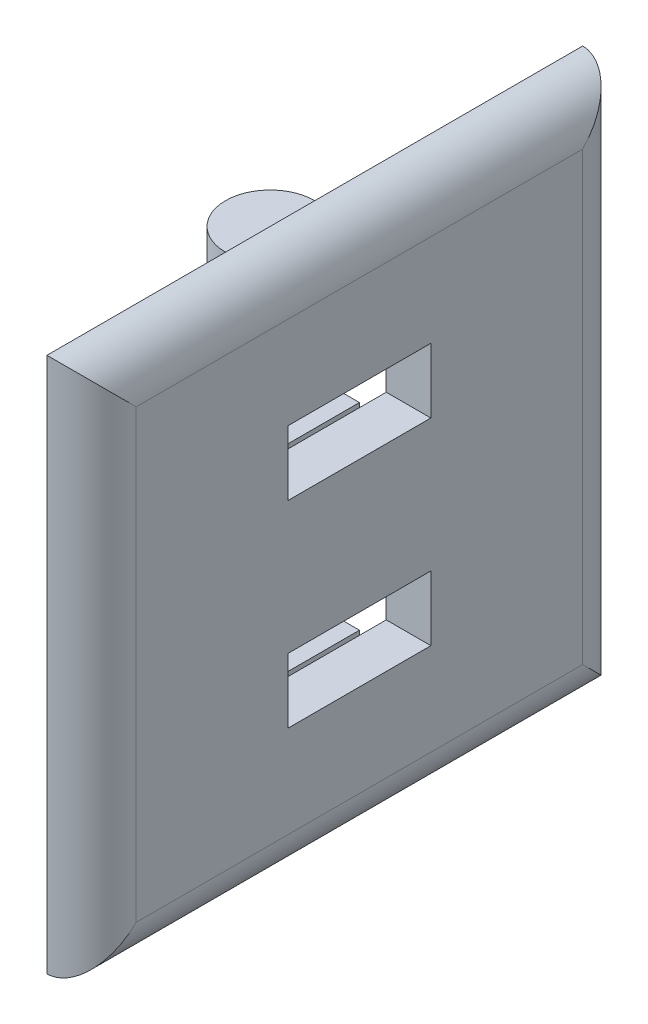
ISO-10303-21;
HEADER;
FILE_DESCRIPTION(('STEP AP214'),'2;1');
FILE_NAME('part.step','',(''),(''),'','','');
FILE_SCHEMA(('AUTOMOTIVE_DESIGN { 1 0 10303 214 1 1 1 1 }'));
ENDSEC;
DATA;
#1=APPLICATION_CONTEXT('core data for automotive mechanical design processes');
#2=APPLICATION_PROTOCOL_DEFINITION('international standard','automotive_design',2000,#1);
#3=PRODUCT_CONTEXT('',#1,'mechanical');
#4=PRODUCT('Part','Part','',(#3));
#5=PRODUCT_RELATED_PRODUCT_CATEGORY('part','',(#4));
#6=PRODUCT_DEFINITION_FORMATION('','',#4);
#7=PRODUCT_DEFINITION_CONTEXT('part definition',#1,'design');
#8=PRODUCT_DEFINITION('design','',#6,#7);
#9=PRODUCT_DEFINITION_SHAPE('','',#8);
#10=(LENGTH_UNIT() NAMED_UNIT(*) SI_UNIT(.MILLI.,.METRE.));
#11=(NAMED_UNIT(*) PLANE_ANGLE_UNIT() SI_UNIT($,.RADIAN.));
#12=(NAMED_UNIT(*) SI_UNIT($,.STERADIAN.) SOLID_ANGLE_UNIT());
#13=UNCERTAINTY_MEASURE_WITH_UNIT(LENGTH_MEASURE(1.E-05),#10,'distance_accuracy_value','');
#14=(GEOMETRIC_REPRESENTATION_CONTEXT(3) GLOBAL_UNCERTAINTY_ASSIGNED_CONTEXT((#13)) GLOBAL_UNIT_ASSIGNED_CONTEXT((#10,
#11,#12)) REPRESENTATION_CONTEXT('',''));
#15=CARTESIAN_POINT('',(0.,0.,0.));
#16=DIRECTION('',(0.,0.,1.));
#17=DIRECTION('',(1.,0.,0.));
#18=AXIS2_PLACEMENT_3D('',#15,#16,#17);
#19=CARTESIAN_POINT('',(-15.,50.,0.));
#20=DIRECTION('',(0.,-1.,0.));
#21=DIRECTION('',(0.,0.,-1.));
#22=AXIS2_PLACEMENT_3D('',#19,#20,#21);
#23=CYLINDRICAL_SURFACE('',#22,10.);
#24=CARTESIAN_POINT('',(-15.,-28.3333333333333,0.));
#25=DIRECTION('',(0.,-1.,0.));
#26=DIRECTION('',(0.,0.,-1.));
#27=AXIS2_PLACEMENT_3D('',#24,#25,#26);
#28=CIRCLE('',#27,10.);
#29=CARTESIAN_POINT('',(-15.,-28.3333333333333,10.));
#30=VERTEX_POINT('',#29);
#31=CARTESIAN_POINT('',(-15.,-28.3333333333333,-10.));
#32=VERTEX_POINT('',#31);
#33=EDGE_CURVE('E345',#30,#32,#28,.T.);
#34=ORIENTED_EDGE('',*,*,#33,.T.);
#35=DIRECTION('',(0.,-1.,0.));
#36=VECTOR('',#35,1.);
#37=CARTESIAN_POINT('',(-15.,50.,-10.));
#38=LINE('',#37,#36);
#39=CARTESIAN_POINT('',(-15.,-50.,-10.));
#40=VERTEX_POINT('',#39);
#41=EDGE_CURVE('E366',#32,#40,#38,.T.);
#42=ORIENTED_EDGE('',*,*,#41,.T.);
#43=CARTESIAN_POINT('',(-15.,-50.,0.));
#44=DIRECTION('',(0.,1.,0.));
#45=DIRECTION('',(0.,0.,1.));
#46=AXIS2_PLACEMENT_3D('',#43,#44,#45);
#47=CIRCLE('',#46,10.);
#48=CARTESIAN_POINT('',(-15.,-50.,10.));
#49=VERTEX_POINT('',#48);
#50=EDGE_CURVE('E355',#40,#49,#47,.T.);
#51=ORIENTED_EDGE('',*,*,#50,.T.);
#52=DIRECTION('',(0.,-1.,0.));
#53=VECTOR('',#52,1.);
#54=CARTESIAN_POINT('',(-15.,50.,10.));
#55=LINE('',#54,#53);
#56=EDGE_CURVE('E390',#30,#49,#55,.T.);
#57=ORIENTED_EDGE('',*,*,#56,.F.);
#58=EDGE_LOOP('',(#34,#42,#51,#57));
#59=FACE_BOUND('',#58,.T.);
#60=ADVANCED_FACE('F43',(#59),#23,.T.);
#61=CARTESIAN_POINT('',(-15.,-15.8333333333333,0.));
#62=DIRECTION('',(0.,1.,0.));
#63=DIRECTION('',(0.,0.,1.));
#64=AXIS2_PLACEMENT_3D('',#61,#62,#63);
#65=CIRCLE('',#64,10.);
#66=CARTESIAN_POINT('',(-15.,-15.8333333333333,-10.));
#67=VERTEX_POINT('',#66);
#68=CARTESIAN_POINT('',(-15.,-15.8333333333333,10.));
#69=VERTEX_POINT('',#68);
#70=EDGE_CURVE('E350',#67,#69,#65,.T.);
#71=ORIENTED_EDGE('',*,*,#70,.T.);
#72=CARTESIAN_POINT('',(-15.,15.8333333333333,10.));
#73=VERTEX_POINT('',#72);
#74=EDGE_CURVE('E397',#73,#69,#55,.T.);
#75=ORIENTED_EDGE('',*,*,#74,.F.);
#76=CARTESIAN_POINT('',(-15.,15.8333333333333,0.));
#77=DIRECTION('',(0.,-1.,0.));
#78=DIRECTION('',(0.,0.,-1.));
#79=AXIS2_PLACEMENT_3D('',#76,#77,#78);
#80=CIRCLE('',#79,10.);
#81=CARTESIAN_POINT('',(-15.,15.8333333333333,-10.));
#82=VERTEX_POINT('',#81);
#83=EDGE_CURVE('E335',#73,#82,#80,.T.);
#84=ORIENTED_EDGE('',*,*,#83,.T.);
#85=EDGE_CURVE('E381',#82,#67,#38,.T.);
#86=ORIENTED_EDGE('',*,*,#85,.T.);
#87=EDGE_LOOP('',(#71,#75,#84,#86));
#88=FACE_BOUND('',#87,.T.);
#89=ADVANCED_FACE('F483',(#88),#23,.T.);
#90=CARTESIAN_POINT('',(-15.,50.,10.));
#91=DIRECTION('',(0.,0.,-1.));
#92=DIRECTION('',(-1.,0.,0.));
#93=AXIS2_PLACEMENT_3D('',#90,#91,#92);
#94=PLANE('',#93);
#95=ORIENTED_EDGE('',*,*,#74,.T.);
#96=DIRECTION('',(1.,0.,0.));
#97=VECTOR('',#96,1.);
#98=CARTESIAN_POINT('',(-15.,-15.8333333333333,10.));
#99=LINE('',#98,#97);
#100=CARTESIAN_POINT('',(-5.,-15.8333333333333,10.));
#101=VERTEX_POINT('',#100);
#102=EDGE_CURVE('E352',#69,#101,#99,.T.);
#103=ORIENTED_EDGE('',*,*,#102,.T.);
#104=DIRECTION('',(0.,1.,0.));
#105=VECTOR('',#104,1.);
#106=CARTESIAN_POINT('',(-5.,50.,10.));
#107=LINE('',#106,#105);
#108=CARTESIAN_POINT('',(-5.,-14.8333333333333,10.));
#109=VERTEX_POINT('',#108);
#110=EDGE_CURVE('E320',#101,#109,#107,.T.);
#111=ORIENTED_EDGE('',*,*,#110,.T.);
#112=DIRECTION('',(0.,-1.,0.));
#113=VECTOR('',#112,1.);
#114=CARTESIAN_POINT('',(-5.,50.,10.));
#115=LINE('',#114,#113);
#116=CARTESIAN_POINT('',(-5.,14.8333333333333,10.));
#117=VERTEX_POINT('',#116);
#118=EDGE_CURVE('E392',#117,#109,#115,.T.);
#119=ORIENTED_EDGE('',*,*,#118,.F.);
#120=CARTESIAN_POINT('',(-5.,15.8333333333333,10.));
#121=VERTEX_POINT('',#120);
#122=EDGE_CURVE('E391',#121,#117,#115,.T.);
#123=ORIENTED_EDGE('',*,*,#122,.F.);
#124=DIRECTION('',(-1.,0.,0.));
#125=VECTOR('',#124,1.);
#126=CARTESIAN_POINT('',(-15.,15.8333333333333,10.));
#127=LINE('',#126,#125);
#128=EDGE_CURVE('E337',#121,#73,#127,.T.);
#129=ORIENTED_EDGE('',*,*,#128,.T.);
#130=EDGE_LOOP('',(#95,#103,#111,#119,#123,#129));
#131=FACE_BOUND('',#130,.T.);
#132=ADVANCED_FACE('F468',(#131),#94,.F.);
#133=CARTESIAN_POINT('',(-15.,50.,10.));
#134=VERTEX_POINT('',#133);
#135=CARTESIAN_POINT('',(-15.,28.3333333333333,10.));
#136=VERTEX_POINT('',#135);
#137=EDGE_CURVE('E393',#134,#136,#55,.T.);
#138=ORIENTED_EDGE('',*,*,#137,.T.);
#139=DIRECTION('',(1.,0.,0.));
#140=VECTOR('',#139,1.);
#141=CARTESIAN_POINT('',(-15.,28.3333333333333,10.));
#142=LINE('',#141,#140);
#143=CARTESIAN_POINT('',(-5.,28.3333333333333,10.));
#144=VERTEX_POINT('',#143);
#145=EDGE_CURVE('E342',#136,#144,#142,.T.);
#146=ORIENTED_EDGE('',*,*,#145,.T.);
#147=DIRECTION('',(0.,1.,0.));
#148=VECTOR('',#147,1.);
#149=CARTESIAN_POINT('',(-5.,50.,10.));
#150=LINE('',#149,#148);
#151=CARTESIAN_POINT('',(-5.,29.3333333333333,10.));
#152=VERTEX_POINT('',#151);
#153=EDGE_CURVE('E332',#144,#152,#150,.T.);
#154=ORIENTED_EDGE('',*,*,#153,.T.);
#155=CARTESIAN_POINT('',(-5.,50.,10.));
#156=VERTEX_POINT('',#155);
#157=EDGE_CURVE('E387',#156,#152,#115,.T.);
#158=ORIENTED_EDGE('',*,*,#157,.F.);
#159=DIRECTION('',(1.,0.,0.));
#160=VECTOR('',#159,1.);
#161=CARTESIAN_POINT('',(-15.,50.,10.));
#162=LINE('',#161,#160);
#163=EDGE_CURVE('E359',#134,#156,#162,.T.);
#164=ORIENTED_EDGE('',*,*,#163,.F.);
#165=EDGE_LOOP('',(#138,#146,#154,#158,#164));
#166=FACE_BOUND('',#165,.T.);
#167=ADVANCED_FACE('F522',(#166),#94,.F.);
#168=CARTESIAN_POINT('',(-5.,50.,-10.));
#169=DIRECTION('',(0.,0.,1.));
#170=DIRECTION('',(1.,0.,0.));
#171=AXIS2_PLACEMENT_3D('',#168,#169,#170);
#172=PLANE('',#171);
#173=DIRECTION('',(0.,-1.,0.));
#174=VECTOR('',#173,1.);
#175=CARTESIAN_POINT('',(-5.,50.,-10.));
#176=LINE('',#175,#174);
#177=CARTESIAN_POINT('',(-5.,15.8333333333333,-10.));
#178=VERTEX_POINT('',#177);
#179=CARTESIAN_POINT('',(-5.,14.8333333333333,-10.));
#180=VERTEX_POINT('',#179);
#181=EDGE_CURVE('E385',#178,#180,#176,.T.);
#182=ORIENTED_EDGE('',*,*,#181,.T.);
#183=CARTESIAN_POINT('',(-5.,-14.8333333333333,-10.));
#184=VERTEX_POINT('',#183);
#185=EDGE_CURVE('E386',#180,#184,#176,.T.);
#186=ORIENTED_EDGE('',*,*,#185,.T.);
#187=DIRECTION('',(0.,-1.,0.));
#188=VECTOR('',#187,1.);
#189=CARTESIAN_POINT('',(-5.,50.,-10.));
#190=LINE('',#189,#188);
#191=CARTESIAN_POINT('',(-5.,-15.8333333333333,-10.));
#192=VERTEX_POINT('',#191);
#193=EDGE_CURVE('E315',#184,#192,#190,.T.);
#194=ORIENTED_EDGE('',*,*,#193,.T.);
#195=DIRECTION('',(-1.,0.,0.));
#196=VECTOR('',#195,1.);
#197=CARTESIAN_POINT('',(-5.,-15.8333333333333,-10.));
#198=LINE('',#197,#196);
#199=EDGE_CURVE('E11',#192,#67,#198,.T.);
#200=ORIENTED_EDGE('',*,*,#199,.T.);
#201=ORIENTED_EDGE('',*,*,#85,.F.);
#202=DIRECTION('',(1.,0.,0.));
#203=VECTOR('',#202,1.);
#204=CARTESIAN_POINT('',(-5.,15.8333333333333,-10.));
#205=LINE('',#204,#203);
#206=EDGE_CURVE('E420',#82,#178,#205,.T.);
#207=ORIENTED_EDGE('',*,*,#206,.T.);
#208=EDGE_LOOP('',(#182,#186,#194,#200,#201,#207));
#209=FACE_BOUND('',#208,.T.);
#210=ADVANCED_FACE('F453',(#209),#172,.F.);
#211=CARTESIAN_POINT('',(-5.,50.,-10.));
#212=VERTEX_POINT('',#211);
#213=CARTESIAN_POINT('',(-5.,29.3333333333333,-10.));
#214=VERTEX_POINT('',#213);
#215=EDGE_CURVE('E382',#212,#214,#176,.T.);
#216=ORIENTED_EDGE('',*,*,#215,.T.);
#217=DIRECTION('',(0.,-1.,0.));
#218=VECTOR('',#217,1.);
#219=CARTESIAN_POINT('',(-5.,50.,-10.));
#220=LINE('',#219,#218);
#221=CARTESIAN_POINT('',(-5.,28.3333333333333,-10.));
#222=VERTEX_POINT('',#221);
#223=EDGE_CURVE('E327',#214,#222,#220,.T.);
#224=ORIENTED_EDGE('',*,*,#223,.T.);
#225=DIRECTION('',(-1.,0.,0.));
#226=VECTOR('',#225,1.);
#227=CARTESIAN_POINT('',(-5.,28.3333333333333,-10.));
#228=LINE('',#227,#226);
#229=CARTESIAN_POINT('',(-15.,28.3333333333333,-10.));
#230=VERTEX_POINT('',#229);
#231=EDGE_CURVE('E431',#222,#230,#228,.T.);
#232=ORIENTED_EDGE('',*,*,#231,.T.);
#233=CARTESIAN_POINT('',(-15.,50.,-10.));
#234=VERTEX_POINT('',#233);
#235=EDGE_CURVE('E377',#234,#230,#38,.T.);
#236=ORIENTED_EDGE('',*,*,#235,.F.);
#237=DIRECTION('',(-1.,0.,0.));
#238=VECTOR('',#237,1.);
#239=CARTESIAN_POINT('',(-5.,50.,-10.));
#240=LINE('',#239,#238);
#241=EDGE_CURVE('E364',#212,#234,#240,.T.);
#242=ORIENTED_EDGE('',*,*,#241,.F.);
#243=EDGE_LOOP('',(#216,#224,#232,#236,#242));
#244=FACE_BOUND('',#243,.T.);
#245=ADVANCED_FACE('F529',(#244),#172,.F.);
#246=CARTESIAN_POINT('',(-5.,0.,0.));
#247=DIRECTION('',(-1.,0.,0.));
#248=DIRECTION('',(0.,0.,1.));
#249=AXIS2_PLACEMENT_3D('',#246,#247,#248);
#250=PLANE('',#249);
#251=DIRECTION('',(0.,0.,1.));
#252=VECTOR('',#251,1.);
#253=CARTESIAN_POINT('',(-5.,29.3333333333333,-16.));
#254=LINE('',#253,#252);
#255=CARTESIAN_POINT('',(-5.,29.3333333333333,-16.));
#256=VERTEX_POINT('',#255);
#257=EDGE_CURVE('E230',#256,#214,#254,.T.);
#258=ORIENTED_EDGE('',*,*,#257,.T.);
#259=ORIENTED_EDGE('',*,*,#215,.F.);
#260=DIRECTION('',(0.,0.,-1.));
#261=VECTOR('',#260,1.);
#262=CARTESIAN_POINT('',(-5.,50.,10.));
#263=LINE('',#262,#261);
#264=EDGE_CURVE('E362',#156,#212,#263,.T.);
#265=ORIENTED_EDGE('',*,*,#264,.F.);
#266=ORIENTED_EDGE('',*,*,#157,.T.);
#267=CARTESIAN_POINT('',(-5.,29.3333333333333,16.));
#268=VERTEX_POINT('',#267);
#269=EDGE_CURVE('E244',#152,#268,#254,.T.);
#270=ORIENTED_EDGE('',*,*,#269,.T.);
#271=DIRECTION('',(0.,-1.,0.));
#272=VECTOR('',#271,1.);
#273=CARTESIAN_POINT('',(-5.,29.3333333333333,16.));
#274=LINE('',#273,#272);
#275=CARTESIAN_POINT('',(-5.,14.8333333333333,16.));
#276=VERTEX_POINT('',#275);
#277=EDGE_CURVE('E270',#268,#276,#274,.T.);
#278=ORIENTED_EDGE('',*,*,#277,.T.);
#279=DIRECTION('',(0.,0.,-1.));
#280=VECTOR('',#279,1.);
#281=CARTESIAN_POINT('',(-5.,14.8333333333333,16.));
#282=LINE('',#281,#280);
#283=EDGE_CURVE('E265',#276,#117,#282,.T.);
#284=ORIENTED_EDGE('',*,*,#283,.T.);
#285=ORIENTED_EDGE('',*,*,#118,.T.);
#286=DIRECTION('',(0.,0.,1.));
#287=VECTOR('',#286,1.);
#288=CARTESIAN_POINT('',(-5.,-14.8333333333333,-16.));
#289=LINE('',#288,#287);
#290=CARTESIAN_POINT('',(-5.,-14.8333333333333,16.));
#291=VERTEX_POINT('',#290);
#292=EDGE_CURVE('E280',#109,#291,#289,.T.);
#293=ORIENTED_EDGE('',*,*,#292,.T.);
#294=DIRECTION('',(0.,-1.,0.));
#295=VECTOR('',#294,1.);
#296=CARTESIAN_POINT('',(-5.,-14.8333333333333,16.));
#297=LINE('',#296,#295);
#298=CARTESIAN_POINT('',(-5.,-29.3333333333333,16.));
#299=VERTEX_POINT('',#298);
#300=EDGE_CURVE('E283',#291,#299,#297,.T.);
#301=ORIENTED_EDGE('',*,*,#300,.T.);
#302=DIRECTION('',(0.,0.,-1.));
#303=VECTOR('',#302,1.);
#304=CARTESIAN_POINT('',(-5.,-29.3333333333333,16.));
#305=LINE('',#304,#303);
#306=CARTESIAN_POINT('',(-5.,-29.3333333333333,10.));
#307=VERTEX_POINT('',#306);
#308=EDGE_CURVE('E284',#299,#307,#305,.T.);
#309=ORIENTED_EDGE('',*,*,#308,.T.);
#310=CARTESIAN_POINT('',(-5.,-50.,10.));
#311=VERTEX_POINT('',#310);
#312=EDGE_CURVE('E384',#307,#311,#115,.T.);
#313=ORIENTED_EDGE('',*,*,#312,.T.);
#314=DIRECTION('',(0.,0.,-1.));
#315=VECTOR('',#314,1.);
#316=CARTESIAN_POINT('',(-5.,-50.,10.));
#317=LINE('',#316,#315);
#318=CARTESIAN_POINT('',(-5.,-50.,-10.));
#319=VERTEX_POINT('',#318);
#320=EDGE_CURVE('E372',#311,#319,#317,.T.);
#321=ORIENTED_EDGE('',*,*,#320,.T.);
#322=CARTESIAN_POINT('',(-5.,-29.3333333333333,-10.));
#323=VERTEX_POINT('',#322);
#324=EDGE_CURVE('E380',#323,#319,#176,.T.);
#325=ORIENTED_EDGE('',*,*,#324,.F.);
#326=CARTESIAN_POINT('',(-5.,-29.3333333333333,-16.));
#327=VERTEX_POINT('',#326);
#328=EDGE_CURVE('E287',#323,#327,#305,.T.);
#329=ORIENTED_EDGE('',*,*,#328,.T.);
#330=DIRECTION('',(0.,1.,0.));
#331=VECTOR('',#330,1.);
#332=CARTESIAN_POINT('',(-5.,-29.3333333333333,-16.));
#333=LINE('',#332,#331);
#334=CARTESIAN_POINT('',(-5.,-14.8333333333333,-16.));
#335=VERTEX_POINT('',#334);
#336=EDGE_CURVE('E288',#327,#335,#333,.T.);
#337=ORIENTED_EDGE('',*,*,#336,.T.);
#338=EDGE_CURVE('E291',#335,#184,#289,.T.);
#339=ORIENTED_EDGE('',*,*,#338,.T.);
#340=ORIENTED_EDGE('',*,*,#185,.F.);
#341=CARTESIAN_POINT('',(-5.,14.8333333333333,-16.));
#342=VERTEX_POINT('',#341);
#343=EDGE_CURVE('E257',#180,#342,#282,.T.);
#344=ORIENTED_EDGE('',*,*,#343,.T.);
#345=DIRECTION('',(0.,1.,0.));
#346=VECTOR('',#345,1.);
#347=CARTESIAN_POINT('',(-5.,14.8333333333333,-16.));
#348=LINE('',#347,#346);
#349=EDGE_CURVE('E247',#342,#256,#348,.T.);
#350=ORIENTED_EDGE('',*,*,#349,.T.);
#351=EDGE_LOOP('',(#258,#259,#265,#266,#270,#278,#284,#285,#293,#301,#309,#313,#321,#325,#329,
#337,#339,#340,#344,#350));
#352=FACE_BOUND('',#351,.T.);
#353=DIRECTION('',(0.,0.,1.));
#354=VECTOR('',#353,1.);
#355=CARTESIAN_POINT('',(-5.,60.,-60.));
#356=LINE('',#355,#354);
#357=CARTESIAN_POINT('',(-5.,60.,-60.));
#358=VERTEX_POINT('',#357);
#359=CARTESIAN_POINT('',(-5.,60.,60.));
#360=VERTEX_POINT('',#359);
#361=EDGE_CURVE('E398',#358,#360,#356,.T.);
#362=ORIENTED_EDGE('',*,*,#361,.F.);
#363=DIRECTION('',(0.,1.,0.));
#364=VECTOR('',#363,1.);
#365=CARTESIAN_POINT('',(-5.,-60.,-60.));
#366=LINE('',#365,#364);
#367=CARTESIAN_POINT('',(-5.,-60.,-60.));
#368=VERTEX_POINT('',#367);
#369=EDGE_CURVE('E408',#368,#358,#366,.T.);
#370=ORIENTED_EDGE('',*,*,#369,.F.);
#371=DIRECTION('',(0.,0.,-1.));
#372=VECTOR('',#371,1.);
#373=CARTESIAN_POINT('',(-5.,-60.,-60.));
#374=LINE('',#373,#372);
#375=CARTESIAN_POINT('',(-5.,-60.,60.));
#376=VERTEX_POINT('',#375);
#377=EDGE_CURVE('E405',#376,#368,#374,.T.);
#378=ORIENTED_EDGE('',*,*,#377,.F.);
#379=DIRECTION('',(0.,-1.,0.));
#380=VECTOR('',#379,1.);
#381=CARTESIAN_POINT('',(-5.,-60.,60.));
#382=LINE('',#381,#380);
#383=EDGE_CURVE('E401',#360,#376,#382,.T.);
#384=ORIENTED_EDGE('',*,*,#383,.F.);
#385=EDGE_LOOP('',(#362,#370,#378,#384));
#386=FACE_BOUND('',#385,.T.);
#387=ADVANCED_FACE('F254',(#352,#386),#250,.T.);
#388=CARTESIAN_POINT('',(5.,0.,0.));
#389=DIRECTION('',(-1.,0.,0.));
#390=DIRECTION('',(0.,0.,1.));
#391=AXIS2_PLACEMENT_3D('',#388,#389,#390);
#392=PLANE('',#391);
#393=DIRECTION('',(0.,0.,1.));
#394=VECTOR('',#393,1.);
#395=CARTESIAN_POINT('',(5.,29.3333333333333,-16.));
#396=LINE('',#395,#394);
#397=CARTESIAN_POINT('',(5.,29.3333333333333,-16.));
#398=VERTEX_POINT('',#397);
#399=CARTESIAN_POINT('',(5.,29.3333333333333,16.));
#400=VERTEX_POINT('',#399);
#401=EDGE_CURVE('E259',#398,#400,#396,.T.);
#402=ORIENTED_EDGE('',*,*,#401,.F.);
#403=DIRECTION('',(0.,1.,0.));
#404=VECTOR('',#403,1.);
#405=CARTESIAN_POINT('',(5.,14.8333333333333,-16.));
#406=LINE('',#405,#404);
#407=CARTESIAN_POINT('',(5.,14.8333333333333,-16.));
#408=VERTEX_POINT('',#407);
#409=EDGE_CURVE('E250',#408,#398,#406,.T.);
#410=ORIENTED_EDGE('',*,*,#409,.F.);
#411=DIRECTION('',(0.,0.,-1.));
#412=VECTOR('',#411,1.);
#413=CARTESIAN_POINT('',(5.,14.8333333333333,16.));
#414=LINE('',#413,#412);
#415=CARTESIAN_POINT('',(5.,14.8333333333333,16.));
#416=VERTEX_POINT('',#415);
#417=EDGE_CURVE('E263',#416,#408,#414,.T.);
#418=ORIENTED_EDGE('',*,*,#417,.F.);
#419=DIRECTION('',(0.,-1.,0.));
#420=VECTOR('',#419,1.);
#421=CARTESIAN_POINT('',(5.,29.3333333333333,16.));
#422=LINE('',#421,#420);
#423=EDGE_CURVE('E58',#400,#416,#422,.T.);
#424=ORIENTED_EDGE('',*,*,#423,.F.);
#425=EDGE_LOOP('',(#402,#410,#418,#424));
#426=FACE_BOUND('',#425,.T.);
#427=DIRECTION('',(0.,0.,-1.));
#428=VECTOR('',#427,1.);
#429=CARTESIAN_POINT('',(5.,-29.3333333333333,16.));
#430=LINE('',#429,#428);
#431=CARTESIAN_POINT('',(5.,-29.3333333333333,16.));
#432=VERTEX_POINT('',#431);
#433=CARTESIAN_POINT('',(5.,-29.3333333333333,-16.));
#434=VERTEX_POINT('',#433);
#435=EDGE_CURVE('E308',#432,#434,#430,.T.);
#436=ORIENTED_EDGE('',*,*,#435,.F.);
#437=DIRECTION('',(0.,-1.,0.));
#438=VECTOR('',#437,1.);
#439=CARTESIAN_POINT('',(5.,-14.8333333333333,16.));
#440=LINE('',#439,#438);
#441=CARTESIAN_POINT('',(5.,-14.8333333333333,16.));
#442=VERTEX_POINT('',#441);
#443=EDGE_CURVE('E305',#442,#432,#440,.T.);
#444=ORIENTED_EDGE('',*,*,#443,.F.);
#445=DIRECTION('',(0.,0.,1.));
#446=VECTOR('',#445,1.);
#447=CARTESIAN_POINT('',(5.,-14.8333333333333,-16.));
#448=LINE('',#447,#446);
#449=CARTESIAN_POINT('',(5.,-14.8333333333333,-16.));
#450=VERTEX_POINT('',#449);
#451=EDGE_CURVE('E302',#450,#442,#448,.T.);
#452=ORIENTED_EDGE('',*,*,#451,.F.);
#453=DIRECTION('',(0.,1.,0.));
#454=VECTOR('',#453,1.);
#455=CARTESIAN_POINT('',(5.,-29.3333333333333,-16.));
#456=LINE('',#455,#454);
#457=EDGE_CURVE('E66',#434,#450,#456,.T.);
#458=ORIENTED_EDGE('',*,*,#457,.F.);
#459=EDGE_LOOP('',(#436,#444,#452,#458));
#460=FACE_BOUND('',#459,.T.);
#461=DIRECTION('',(0.,1.,0.));
#462=VECTOR('',#461,1.);
#463=CARTESIAN_POINT('',(5.,0.,-50.));
#464=LINE('',#463,#462);
#465=CARTESIAN_POINT('',(5.,-50.,-50.));
#466=VERTEX_POINT('',#465);
#467=CARTESIAN_POINT('',(5.,50.,-50.));
#468=VERTEX_POINT('',#467);
#469=EDGE_CURVE('E415',#466,#468,#464,.T.);
#470=ORIENTED_EDGE('',*,*,#469,.T.);
#471=DIRECTION('',(0.,0.,1.));
#472=VECTOR('',#471,1.);
#473=CARTESIAN_POINT('',(5.,50.,0.));
#474=LINE('',#473,#472);
#475=CARTESIAN_POINT('',(5.,50.,50.));
#476=VERTEX_POINT('',#475);
#477=EDGE_CURVE('E417',#468,#476,#474,.T.);
#478=ORIENTED_EDGE('',*,*,#477,.T.);
#479=DIRECTION('',(0.,-1.,0.));
#480=VECTOR('',#479,1.);
#481=CARTESIAN_POINT('',(5.,0.,50.));
#482=LINE('',#481,#480);
#483=CARTESIAN_POINT('',(5.,-50.,50.));
#484=VERTEX_POINT('',#483);
#485=EDGE_CURVE('E411',#476,#484,#482,.T.);
#486=ORIENTED_EDGE('',*,*,#485,.T.);
#487=DIRECTION('',(0.,0.,-1.));
#488=VECTOR('',#487,1.);
#489=CARTESIAN_POINT('',(5.,-50.,0.));
#490=LINE('',#489,#488);
#491=EDGE_CURVE('E413',#484,#466,#490,.T.);
#492=ORIENTED_EDGE('',*,*,#491,.T.);
#493=EDGE_LOOP('',(#470,#478,#486,#492));
#494=FACE_BOUND('',#493,.T.);
#495=ADVANCED_FACE('F504',(#426,#460,#494),#392,.F.);
#496=CARTESIAN_POINT('',(-5.,-50.,0.));
#497=DIRECTION('',(0.,0.,-1.));
#498=DIRECTION('',(-1.,0.,0.));
#499=AXIS2_PLACEMENT_3D('',#496,#497,#498);
#500=CYLINDRICAL_SURFACE('',#499,10.);
#501=CARTESIAN_POINT('',(-5.,-50.,50.));
#502=DIRECTION('',(0.,-0.707106781186547,-0.707106781186547));
#503=DIRECTION('',(0.,-0.707106781186547,0.707106781186547));
#504=AXIS2_PLACEMENT_3D('',#501,#502,#503);
#505=ELLIPSE('',#504,14.1421356237309,10.);
#506=EDGE_CURVE('E424',#376,#484,#505,.F.);
#507=ORIENTED_EDGE('',*,*,#506,.F.);
#508=ORIENTED_EDGE('',*,*,#377,.T.);
#509=CARTESIAN_POINT('',(-5.,-50.,-50.));
#510=DIRECTION('',(0.,0.707106781186547,-0.707106781186547));
#511=DIRECTION('',(0.,-0.707106781186547,-0.707106781186547));
#512=AXIS2_PLACEMENT_3D('',#509,#510,#511);
#513=ELLIPSE('',#512,14.1421356237309,10.);
#514=EDGE_CURVE('E402',#466,#368,#513,.T.);
#515=ORIENTED_EDGE('',*,*,#514,.F.);
#516=ORIENTED_EDGE('',*,*,#491,.F.);
#517=EDGE_LOOP('',(#507,#508,#515,#516));
#518=FACE_BOUND('',#517,.T.);
#519=ADVANCED_FACE('F45',(#518),#500,.T.);
#520=CARTESIAN_POINT('',(-5.,0.,-50.));
#521=DIRECTION('',(0.,1.,0.));
#522=DIRECTION('',(0.,0.,1.));
#523=AXIS2_PLACEMENT_3D('',#520,#521,#522);
#524=CYLINDRICAL_SURFACE('',#523,10.);
#525=ORIENTED_EDGE('',*,*,#514,.T.);
#526=ORIENTED_EDGE('',*,*,#369,.T.);
#527=CARTESIAN_POINT('',(-5.,50.,-50.));
#528=DIRECTION('',(0.,0.707106781186547,0.707106781186547));
#529=DIRECTION('',(0.,0.707106781186547,-0.707106781186547));
#530=AXIS2_PLACEMENT_3D('',#527,#528,#529);
#531=ELLIPSE('',#530,14.1421356237309,10.);
#532=EDGE_CURVE('E422',#468,#358,#531,.T.);
#533=ORIENTED_EDGE('',*,*,#532,.F.);
#534=ORIENTED_EDGE('',*,*,#469,.F.);
#535=EDGE_LOOP('',(#525,#526,#533,#534));
#536=FACE_BOUND('',#535,.T.);
#537=ADVANCED_FACE('F763',(#536),#524,.T.);
#538=CARTESIAN_POINT('',(-5.,0.,50.));
#539=DIRECTION('',(0.,-1.,0.));
#540=DIRECTION('',(0.,0.,-1.));
#541=AXIS2_PLACEMENT_3D('',#538,#539,#540);
#542=CYLINDRICAL_SURFACE('',#541,10.);
#543=ORIENTED_EDGE('',*,*,#506,.T.);
#544=ORIENTED_EDGE('',*,*,#485,.F.);
#545=CARTESIAN_POINT('',(-5.,50.,50.));
#546=DIRECTION('',(0.,-0.707106781186547,0.707106781186547));
#547=DIRECTION('',(0.,-0.707106781186547,-0.707106781186547));
#548=AXIS2_PLACEMENT_3D('',#545,#546,#547);
#549=ELLIPSE('',#548,14.1421356237309,10.);
#550=EDGE_CURVE('E396',#360,#476,#549,.F.);
#551=ORIENTED_EDGE('',*,*,#550,.F.);
#552=ORIENTED_EDGE('',*,*,#383,.T.);
#553=EDGE_LOOP('',(#543,#544,#551,#552));
#554=FACE_BOUND('',#553,.T.);
#555=ADVANCED_FACE('F547',(#554),#542,.T.);
#556=CARTESIAN_POINT('',(-5.,50.,0.));
#557=DIRECTION('',(0.,0.,1.));
#558=DIRECTION('',(1.,0.,0.));
#559=AXIS2_PLACEMENT_3D('',#556,#557,#558);
#560=CYLINDRICAL_SURFACE('',#559,10.);
#561=ORIENTED_EDGE('',*,*,#532,.T.);
#562=ORIENTED_EDGE('',*,*,#361,.T.);
#563=ORIENTED_EDGE('',*,*,#550,.T.);
#564=ORIENTED_EDGE('',*,*,#477,.F.);
#565=EDGE_LOOP('',(#561,#562,#563,#564));
#566=FACE_BOUND('',#565,.T.);
#567=ADVANCED_FACE('F538',(#566),#560,.T.);
#568=CARTESIAN_POINT('',(-15.,28.3333333333333,0.));
#569=DIRECTION('',(0.,1.,0.));
#570=DIRECTION('',(0.,0.,1.));
#571=AXIS2_PLACEMENT_3D('',#568,#569,#570);
#572=CIRCLE('',#571,10.);
#573=EDGE_CURVE('E340',#230,#136,#572,.T.);
#574=ORIENTED_EDGE('',*,*,#573,.T.);
#575=ORIENTED_EDGE('',*,*,#137,.F.);
#576=CARTESIAN_POINT('',(-15.,50.,0.));
#577=DIRECTION('',(0.,1.,0.));
#578=DIRECTION('',(0.,0.,1.));
#579=AXIS2_PLACEMENT_3D('',#576,#577,#578);
#580=CIRCLE('',#579,10.);
#581=EDGE_CURVE('E356',#234,#134,#580,.T.);
#582=ORIENTED_EDGE('',*,*,#581,.F.);
#583=ORIENTED_EDGE('',*,*,#235,.T.);
#584=EDGE_LOOP('',(#574,#575,#582,#583));
#585=FACE_BOUND('',#584,.T.);
#586=ADVANCED_FACE('F536',(#585),#23,.T.);
#587=CARTESIAN_POINT('',(-5.,-28.3333333333333,10.));
#588=VERTEX_POINT('',#587);
#589=EDGE_CURVE('E447',#588,#307,#115,.T.);
#590=ORIENTED_EDGE('',*,*,#589,.F.);
#591=DIRECTION('',(-1.,0.,0.));
#592=VECTOR('',#591,1.);
#593=CARTESIAN_POINT('',(-15.,-28.3333333333333,10.));
#594=LINE('',#593,#592);
#595=EDGE_CURVE('E347',#588,#30,#594,.T.);
#596=ORIENTED_EDGE('',*,*,#595,.T.);
#597=ORIENTED_EDGE('',*,*,#56,.T.);
#598=DIRECTION('',(1.,0.,0.));
#599=VECTOR('',#598,1.);
#600=CARTESIAN_POINT('',(-15.,-50.,10.));
#601=LINE('',#600,#599);
#602=EDGE_CURVE('E369',#49,#311,#601,.T.);
#603=ORIENTED_EDGE('',*,*,#602,.T.);
#604=ORIENTED_EDGE('',*,*,#312,.F.);
#605=EDGE_LOOP('',(#590,#596,#597,#603,#604));
#606=FACE_BOUND('',#605,.T.);
#607=ADVANCED_FACE('F478',(#606),#94,.F.);
#608=ORIENTED_EDGE('',*,*,#41,.F.);
#609=DIRECTION('',(1.,0.,0.));
#610=VECTOR('',#609,1.);
#611=CARTESIAN_POINT('',(-5.,-28.3333333333333,-10.));
#612=LINE('',#611,#610);
#613=CARTESIAN_POINT('',(-5.,-28.3333333333333,-10.));
#614=VERTEX_POINT('',#613);
#615=EDGE_CURVE('E51',#32,#614,#612,.T.);
#616=ORIENTED_EDGE('',*,*,#615,.T.);
#617=EDGE_CURVE('E439',#614,#323,#176,.T.);
#618=ORIENTED_EDGE('',*,*,#617,.T.);
#619=ORIENTED_EDGE('',*,*,#324,.T.);
#620=DIRECTION('',(-1.,0.,0.));
#621=VECTOR('',#620,1.);
#622=CARTESIAN_POINT('',(-5.,-50.,-10.));
#623=LINE('',#622,#621);
#624=EDGE_CURVE('E360',#319,#40,#623,.T.);
#625=ORIENTED_EDGE('',*,*,#624,.T.);
#626=EDGE_LOOP('',(#608,#616,#618,#619,#625));
#627=FACE_BOUND('',#626,.T.);
#628=ADVANCED_FACE('F438',(#627),#172,.F.);
#629=CARTESIAN_POINT('',(-15.,50.,0.));
#630=DIRECTION('',(0.,1.,0.));
#631=DIRECTION('',(0.,0.,1.));
#632=AXIS2_PLACEMENT_3D('',#629,#630,#631);
#633=PLANE('',#632);
#634=ORIENTED_EDGE('',*,*,#581,.T.);
#635=ORIENTED_EDGE('',*,*,#163,.T.);
#636=ORIENTED_EDGE('',*,*,#264,.T.);
#637=ORIENTED_EDGE('',*,*,#241,.T.);
#638=EDGE_LOOP('',(#634,#635,#636,#637));
#639=FACE_BOUND('',#638,.T.);
#640=ADVANCED_FACE('F533',(#639),#633,.T.);
#641=CARTESIAN_POINT('',(-15.,-50.,0.));
#642=DIRECTION('',(0.,1.,0.));
#643=DIRECTION('',(0.,0.,1.));
#644=AXIS2_PLACEMENT_3D('',#641,#642,#643);
#645=PLANE('',#644);
#646=ORIENTED_EDGE('',*,*,#50,.F.);
#647=ORIENTED_EDGE('',*,*,#624,.F.);
#648=ORIENTED_EDGE('',*,*,#320,.F.);
#649=ORIENTED_EDGE('',*,*,#602,.F.);
#650=EDGE_LOOP('',(#646,#647,#648,#649));
#651=FACE_BOUND('',#650,.T.);
#652=ADVANCED_FACE('F477',(#651),#645,.F.);
#653=CARTESIAN_POINT('',(-25.,28.3333333333333,-15.));
#654=DIRECTION('',(0.,1.,0.));
#655=DIRECTION('',(0.,0.,1.));
#656=AXIS2_PLACEMENT_3D('',#653,#654,#655);
#657=PLANE('',#656);
#658=ORIENTED_EDGE('',*,*,#231,.F.);
#659=DIRECTION('',(0.,0.,1.));
#660=VECTOR('',#659,1.);
#661=CARTESIAN_POINT('',(-5.,28.3333333333333,-15.));
#662=LINE('',#661,#660);
#663=EDGE_CURVE('E323',#222,#144,#662,.T.);
#664=ORIENTED_EDGE('',*,*,#663,.T.);
#665=ORIENTED_EDGE('',*,*,#145,.F.);
#666=ORIENTED_EDGE('',*,*,#573,.F.);
#667=EDGE_LOOP('',(#658,#664,#665,#666));
#668=FACE_BOUND('',#667,.T.);
#669=ADVANCED_FACE('F527',(#668),#657,.F.);
#670=CARTESIAN_POINT('',(-25.,15.8333333333333,-15.));
#671=DIRECTION('',(0.,-1.,0.));
#672=DIRECTION('',(0.,0.,-1.));
#673=AXIS2_PLACEMENT_3D('',#670,#671,#672);
#674=PLANE('',#673);
#675=ORIENTED_EDGE('',*,*,#128,.F.);
#676=DIRECTION('',(0.,0.,-1.));
#677=VECTOR('',#676,1.);
#678=CARTESIAN_POINT('',(-5.,15.8333333333333,-15.));
#679=LINE('',#678,#677);
#680=EDGE_CURVE('E324',#121,#178,#679,.T.);
#681=ORIENTED_EDGE('',*,*,#680,.T.);
#682=ORIENTED_EDGE('',*,*,#206,.F.);
#683=ORIENTED_EDGE('',*,*,#83,.F.);
#684=EDGE_LOOP('',(#675,#681,#682,#683));
#685=FACE_BOUND('',#684,.T.);
#686=ADVANCED_FACE('F462',(#685),#674,.F.);
#687=CARTESIAN_POINT('',(-25.,-15.8333333333333,-15.));
#688=DIRECTION('',(0.,1.,0.));
#689=DIRECTION('',(0.,0.,1.));
#690=AXIS2_PLACEMENT_3D('',#687,#688,#689);
#691=PLANE('',#690);
#692=ORIENTED_EDGE('',*,*,#199,.F.);
#693=DIRECTION('',(0.,0.,1.));
#694=VECTOR('',#693,1.);
#695=CARTESIAN_POINT('',(-5.,-15.8333333333333,-15.));
#696=LINE('',#695,#694);
#697=EDGE_CURVE('E277',#192,#101,#696,.T.);
#698=ORIENTED_EDGE('',*,*,#697,.T.);
#699=ORIENTED_EDGE('',*,*,#102,.F.);
#700=ORIENTED_EDGE('',*,*,#70,.F.);
#701=EDGE_LOOP('',(#692,#698,#699,#700));
#702=FACE_BOUND('',#701,.T.);
#703=ADVANCED_FACE('F487',(#702),#691,.F.);
#704=CARTESIAN_POINT('',(-25.,-28.3333333333333,-15.));
#705=DIRECTION('',(0.,-1.,0.));
#706=DIRECTION('',(0.,0.,-1.));
#707=AXIS2_PLACEMENT_3D('',#704,#705,#706);
#708=PLANE('',#707);
#709=ORIENTED_EDGE('',*,*,#595,.F.);
#710=DIRECTION('',(0.,0.,-1.));
#711=VECTOR('',#710,1.);
#712=CARTESIAN_POINT('',(-5.,-28.3333333333333,-15.));
#713=LINE('',#712,#711);
#714=EDGE_CURVE('E312',#588,#614,#713,.T.);
#715=ORIENTED_EDGE('',*,*,#714,.T.);
#716=ORIENTED_EDGE('',*,*,#615,.F.);
#717=ORIENTED_EDGE('',*,*,#33,.F.);
#718=EDGE_LOOP('',(#709,#715,#716,#717));
#719=FACE_BOUND('',#718,.T.);
#720=ADVANCED_FACE('F442',(#719),#708,.F.);
#721=CARTESIAN_POINT('',(-5.,0.,0.));
#722=DIRECTION('',(-1.,0.,0.));
#723=DIRECTION('',(0.,0.,1.));
#724=AXIS2_PLACEMENT_3D('',#721,#722,#723);
#725=PLANE('',#724);
#726=ORIENTED_EDGE('',*,*,#697,.F.);
#727=ORIENTED_EDGE('',*,*,#193,.F.);
#728=EDGE_CURVE('E299',#184,#109,#289,.T.);
#729=ORIENTED_EDGE('',*,*,#728,.T.);
#730=ORIENTED_EDGE('',*,*,#110,.F.);
#731=EDGE_LOOP('',(#726,#727,#729,#730));
#732=FACE_BOUND('',#731,.T.);
#733=ADVANCED_FACE('F489',(#732),#725,.F.);
#734=ORIENTED_EDGE('',*,*,#714,.F.);
#735=ORIENTED_EDGE('',*,*,#589,.T.);
#736=EDGE_CURVE('E294',#307,#323,#305,.T.);
#737=ORIENTED_EDGE('',*,*,#736,.T.);
#738=ORIENTED_EDGE('',*,*,#617,.F.);
#739=EDGE_LOOP('',(#734,#735,#737,#738));
#740=FACE_BOUND('',#739,.T.);
#741=ADVANCED_FACE('F445',(#740),#725,.F.);
#742=CARTESIAN_POINT('',(-40.1318943411823,-14.8333333333333,16.));
#743=DIRECTION('',(0.,0.,1.));
#744=DIRECTION('',(1.,0.,0.));
#745=AXIS2_PLACEMENT_3D('',#742,#743,#744);
#746=PLANE('',#745);
#747=DIRECTION('',(1.,0.,0.));
#748=VECTOR('',#747,1.);
#749=CARTESIAN_POINT('',(-40.1318943411823,-14.8333333333333,16.));
#750=LINE('',#749,#748);
#751=EDGE_CURVE('E278',#291,#442,#750,.T.);
#752=ORIENTED_EDGE('',*,*,#751,.T.);
#753=ORIENTED_EDGE('',*,*,#443,.T.);
#754=DIRECTION('',(1.,0.,0.));
#755=VECTOR('',#754,1.);
#756=CARTESIAN_POINT('',(-40.1318943411823,-29.3333333333333,16.));
#757=LINE('',#756,#755);
#758=EDGE_CURVE('E281',#299,#432,#757,.T.);
#759=ORIENTED_EDGE('',*,*,#758,.F.);
#760=ORIENTED_EDGE('',*,*,#300,.F.);
#761=EDGE_LOOP('',(#752,#753,#759,#760));
#762=FACE_BOUND('',#761,.T.);
#763=ADVANCED_FACE('F508',(#762),#746,.F.);
#764=CARTESIAN_POINT('',(-40.1318943411823,-29.3333333333333,16.));
#765=DIRECTION('',(0.,-1.,0.));
#766=DIRECTION('',(0.,0.,-1.));
#767=AXIS2_PLACEMENT_3D('',#764,#765,#766);
#768=PLANE('',#767);
#769=ORIENTED_EDGE('',*,*,#758,.T.);
#770=ORIENTED_EDGE('',*,*,#435,.T.);
#771=DIRECTION('',(1.,0.,0.));
#772=VECTOR('',#771,1.);
#773=CARTESIAN_POINT('',(-40.1318943411823,-29.3333333333333,-16.));
#774=LINE('',#773,#772);
#775=EDGE_CURVE('E285',#327,#434,#774,.T.);
#776=ORIENTED_EDGE('',*,*,#775,.F.);
#777=ORIENTED_EDGE('',*,*,#328,.F.);
#778=ORIENTED_EDGE('',*,*,#736,.F.);
#779=ORIENTED_EDGE('',*,*,#308,.F.);
#780=EDGE_LOOP('',(#769,#770,#776,#777,#778,#779));
#781=FACE_BOUND('',#780,.T.);
#782=ADVANCED_FACE('F495',(#781),#768,.F.);
#783=CARTESIAN_POINT('',(-40.1318943411823,-29.3333333333333,-16.));
#784=DIRECTION('',(0.,0.,-1.));
#785=DIRECTION('',(-1.,0.,0.));
#786=AXIS2_PLACEMENT_3D('',#783,#784,#785);
#787=PLANE('',#786);
#788=ORIENTED_EDGE('',*,*,#775,.T.);
#789=ORIENTED_EDGE('',*,*,#457,.T.);
#790=DIRECTION('',(1.,0.,0.));
#791=VECTOR('',#790,1.);
#792=CARTESIAN_POINT('',(-40.1318943411823,-14.8333333333333,-16.));
#793=LINE('',#792,#791);
#794=EDGE_CURVE('E289',#335,#450,#793,.T.);
#795=ORIENTED_EDGE('',*,*,#794,.F.);
#796=ORIENTED_EDGE('',*,*,#336,.F.);
#797=EDGE_LOOP('',(#788,#789,#795,#796));
#798=FACE_BOUND('',#797,.T.);
#799=ADVANCED_FACE('F497',(#798),#787,.F.);
#800=CARTESIAN_POINT('',(-40.1318943411823,-14.8333333333333,-16.));
#801=DIRECTION('',(0.,1.,0.));
#802=DIRECTION('',(0.,0.,1.));
#803=AXIS2_PLACEMENT_3D('',#800,#801,#802);
#804=PLANE('',#803);
#805=ORIENTED_EDGE('',*,*,#794,.T.);
#806=ORIENTED_EDGE('',*,*,#451,.T.);
#807=ORIENTED_EDGE('',*,*,#751,.F.);
#808=ORIENTED_EDGE('',*,*,#292,.F.);
#809=ORIENTED_EDGE('',*,*,#728,.F.);
#810=ORIENTED_EDGE('',*,*,#338,.F.);
#811=EDGE_LOOP('',(#805,#806,#807,#808,#809,#810));
#812=FACE_BOUND('',#811,.T.);
#813=ADVANCED_FACE('F500',(#812),#804,.F.);
#814=CARTESIAN_POINT('',(-5.,0.,0.));
#815=DIRECTION('',(-1.,0.,0.));
#816=DIRECTION('',(0.,0.,1.));
#817=AXIS2_PLACEMENT_3D('',#814,#815,#816);
#818=PLANE('',#817);
#819=ORIENTED_EDGE('',*,*,#663,.F.);
#820=ORIENTED_EDGE('',*,*,#223,.F.);
#821=EDGE_CURVE('E237',#214,#152,#254,.T.);
#822=ORIENTED_EDGE('',*,*,#821,.T.);
#823=ORIENTED_EDGE('',*,*,#153,.F.);
#824=EDGE_LOOP('',(#819,#820,#822,#823));
#825=FACE_BOUND('',#824,.T.);
#826=ADVANCED_FACE('F520',(#825),#818,.F.);
#827=ORIENTED_EDGE('',*,*,#680,.F.);
#828=ORIENTED_EDGE('',*,*,#122,.T.);
#829=EDGE_CURVE('E269',#117,#180,#282,.T.);
#830=ORIENTED_EDGE('',*,*,#829,.T.);
#831=ORIENTED_EDGE('',*,*,#181,.F.);
#832=EDGE_LOOP('',(#827,#828,#830,#831));
#833=FACE_BOUND('',#832,.T.);
#834=ADVANCED_FACE('F458',(#833),#818,.F.);
#835=CARTESIAN_POINT('',(-40.1318943411823,14.8333333333333,-16.));
#836=DIRECTION('',(0.,0.,-1.));
#837=DIRECTION('',(-1.,0.,0.));
#838=AXIS2_PLACEMENT_3D('',#835,#836,#837);
#839=PLANE('',#838);
#840=DIRECTION('',(1.,0.,0.));
#841=VECTOR('',#840,1.);
#842=CARTESIAN_POINT('',(-40.1318943411823,14.8333333333333,-16.));
#843=LINE('',#842,#841);
#844=EDGE_CURVE('E268',#342,#408,#843,.T.);
#845=ORIENTED_EDGE('',*,*,#844,.T.);
#846=ORIENTED_EDGE('',*,*,#409,.T.);
#847=DIRECTION('',(1.,0.,0.));
#848=VECTOR('',#847,1.);
#849=CARTESIAN_POINT('',(-40.1318943411823,29.3333333333333,-16.));
#850=LINE('',#849,#848);
#851=EDGE_CURVE('E234',#256,#398,#850,.T.);
#852=ORIENTED_EDGE('',*,*,#851,.F.);
#853=ORIENTED_EDGE('',*,*,#349,.F.);
#854=EDGE_LOOP('',(#845,#846,#852,#853));
#855=FACE_BOUND('',#854,.T.);
#856=ADVANCED_FACE('F246',(#855),#839,.F.);
#857=CARTESIAN_POINT('',(-40.1318943411823,29.3333333333333,-16.));
#858=DIRECTION('',(0.,1.,0.));
#859=DIRECTION('',(0.,0.,1.));
#860=AXIS2_PLACEMENT_3D('',#857,#858,#859);
#861=PLANE('',#860);
#862=ORIENTED_EDGE('',*,*,#851,.T.);
#863=ORIENTED_EDGE('',*,*,#401,.T.);
#864=DIRECTION('',(1.,0.,0.));
#865=VECTOR('',#864,1.);
#866=CARTESIAN_POINT('',(-40.1318943411823,29.3333333333333,16.));
#867=LINE('',#866,#865);
#868=EDGE_CURVE('E242',#268,#400,#867,.T.);
#869=ORIENTED_EDGE('',*,*,#868,.F.);
#870=ORIENTED_EDGE('',*,*,#269,.F.);
#871=ORIENTED_EDGE('',*,*,#821,.F.);
#872=ORIENTED_EDGE('',*,*,#257,.F.);
#873=EDGE_LOOP('',(#862,#863,#869,#870,#871,#872));
#874=FACE_BOUND('',#873,.T.);
#875=ADVANCED_FACE('F232',(#874),#861,.F.);
#876=CARTESIAN_POINT('',(-40.1318943411823,29.3333333333333,16.));
#877=DIRECTION('',(0.,0.,1.));
#878=DIRECTION('',(1.,0.,0.));
#879=AXIS2_PLACEMENT_3D('',#876,#877,#878);
#880=PLANE('',#879);
#881=ORIENTED_EDGE('',*,*,#868,.T.);
#882=ORIENTED_EDGE('',*,*,#423,.T.);
#883=DIRECTION('',(1.,0.,0.));
#884=VECTOR('',#883,1.);
#885=CARTESIAN_POINT('',(-40.1318943411823,14.8333333333333,16.));
#886=LINE('',#885,#884);
#887=EDGE_CURVE('E272',#276,#416,#886,.T.);
#888=ORIENTED_EDGE('',*,*,#887,.F.);
#889=ORIENTED_EDGE('',*,*,#277,.F.);
#890=EDGE_LOOP('',(#881,#882,#888,#889));
#891=FACE_BOUND('',#890,.T.);
#892=ADVANCED_FACE('F515',(#891),#880,.F.);
#893=CARTESIAN_POINT('',(-40.1318943411823,14.8333333333333,16.));
#894=DIRECTION('',(0.,-1.,0.));
#895=DIRECTION('',(0.,0.,-1.));
#896=AXIS2_PLACEMENT_3D('',#893,#894,#895);
#897=PLANE('',#896);
#898=ORIENTED_EDGE('',*,*,#887,.T.);
#899=ORIENTED_EDGE('',*,*,#417,.T.);
#900=ORIENTED_EDGE('',*,*,#844,.F.);
#901=ORIENTED_EDGE('',*,*,#343,.F.);
#902=ORIENTED_EDGE('',*,*,#829,.F.);
#903=ORIENTED_EDGE('',*,*,#283,.F.);
#904=EDGE_LOOP('',(#898,#899,#900,#901,#902,#903));
#905=FACE_BOUND('',#904,.T.);
#906=ADVANCED_FACE('F512',(#905),#897,.F.);
#907=CLOSED_SHELL('',(#60,#89,#132,#167,#210,#245,#387,#495,#519,#537,#555,#567,#586,#607,#628,
#640,#652,#669,#686,#703,#720,#733,#741,#763,#782,#799,#813,#826,#834,#856,#875,#892,#906));
#908=MANIFOLD_SOLID_BREP('B2',#907);
#909=ADVANCED_BREP_SHAPE_REPRESENTATION('',(#18,#908),#14);
#910=SHAPE_DEFINITION_REPRESENTATION(#9,#909);
ENDSEC;
END-ISO-10303-21;
